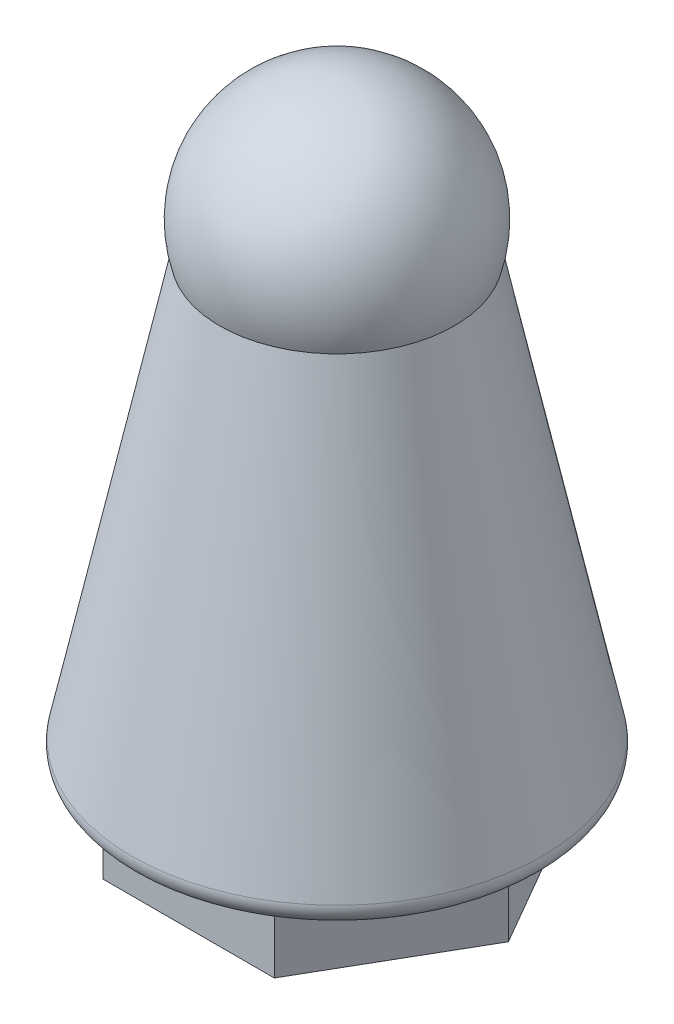
ISO-10303-21;
HEADER;
FILE_DESCRIPTION(('STEP AP214'),'2;1');
FILE_NAME('part.step','',(''),(''),'','','');
FILE_SCHEMA(('AUTOMOTIVE_DESIGN { 1 0 10303 214 1 1 1 1 }'));
ENDSEC;
DATA;
#1=APPLICATION_CONTEXT('core data for automotive mechanical design processes');
#2=APPLICATION_PROTOCOL_DEFINITION('international standard','automotive_design',2000,#1);
#3=PRODUCT_CONTEXT('',#1,'mechanical');
#4=PRODUCT('Part','Part','',(#3));
#5=PRODUCT_RELATED_PRODUCT_CATEGORY('part','',(#4));
#6=PRODUCT_DEFINITION_FORMATION('','',#4);
#7=PRODUCT_DEFINITION_CONTEXT('part definition',#1,'design');
#8=PRODUCT_DEFINITION('design','',#6,#7);
#9=PRODUCT_DEFINITION_SHAPE('','',#8);
#10=(LENGTH_UNIT() NAMED_UNIT(*) SI_UNIT(.MILLI.,.METRE.));
#11=(NAMED_UNIT(*) PLANE_ANGLE_UNIT() SI_UNIT($,.RADIAN.));
#12=(NAMED_UNIT(*) SI_UNIT($,.STERADIAN.) SOLID_ANGLE_UNIT());
#13=UNCERTAINTY_MEASURE_WITH_UNIT(LENGTH_MEASURE(1.E-05),#10,'distance_accuracy_value','');
#14=(GEOMETRIC_REPRESENTATION_CONTEXT(3) GLOBAL_UNCERTAINTY_ASSIGNED_CONTEXT((#13)) GLOBAL_UNIT_ASSIGNED_CONTEXT((#10,
#11,#12)) REPRESENTATION_CONTEXT('',''));
#15=CARTESIAN_POINT('',(0.,0.,0.));
#16=DIRECTION('',(0.,0.,1.));
#17=DIRECTION('',(1.,0.,0.));
#18=AXIS2_PLACEMENT_3D('',#15,#16,#17);
#19=CARTESIAN_POINT('',(0.,70.9501443061777,0.));
#20=DIRECTION('',(0.,-1.,0.));
#21=DIRECTION('',(-1.,0.,0.));
#22=AXIS2_PLACEMENT_3D('',#19,#20,#21);
#23=SPHERICAL_SURFACE('',#22,7.);
#24=CARTESIAN_POINT('',(0.,69.0050824594737,0.));
#25=DIRECTION('',(0.,-1.,0.));
#26=DIRECTION('',(0.,0.,-1.));
#27=AXIS2_PLACEMENT_3D('',#24,#25,#26);
#28=CIRCLE('',#27,6.72433895728766);
#29=CARTESIAN_POINT('',(0.,69.0050824594737,-6.72433895728766));
#30=VERTEX_POINT('',#29);
#31=EDGE_CURVE('E128',#30,#30,#28,.T.);
#32=ORIENTED_EDGE('',*,*,#31,.F.);
#33=EDGE_LOOP('',(#32));
#34=FACE_BOUND('',#33,.T.);
#35=ADVANCED_FACE('F39',(#34),#23,.T.);
#36=CARTESIAN_POINT('',(0.,69.0050824594737,0.));
#37=DIRECTION('',(0.,-1.,0.));
#38=DIRECTION('',(0.,0.,-1.));
#39=AXIS2_PLACEMENT_3D('',#36,#37,#38);
#40=CONICAL_SURFACE('',#39,6.72433895728766,0.20797507853601);
#41=CARTESIAN_POINT('',(0.,45.2115614975069,0.));
#42=DIRECTION('',(0.,1.,0.));
#43=DIRECTION('',(0.,0.,1.));
#44=AXIS2_PLACEMENT_3D('',#41,#42,#43);
#45=CIRCLE('',#44,11.745401021608);
#46=CARTESIAN_POINT('',(0.,45.2115614975069,11.745401021608));
#47=VERTEX_POINT('',#46);
#48=EDGE_CURVE('E11',#47,#47,#45,.T.);
#49=ORIENTED_EDGE('',*,*,#48,.T.);
#50=EDGE_LOOP('',(#49));
#51=FACE_BOUND('',#50,.T.);
#52=ORIENTED_EDGE('',*,*,#31,.T.);
#53=EDGE_LOOP('',(#52));
#54=FACE_BOUND('',#53,.T.);
#55=ADVANCED_FACE('F169',(#51,#54),#40,.T.);
#56=CARTESIAN_POINT('',(-12.,44.0050824594737,0.));
#57=DIRECTION('',(0.,1.,0.));
#58=DIRECTION('',(0.,0.,1.));
#59=AXIS2_PLACEMENT_3D('',#56,#57,#58);
#60=PLANE('',#59);
#61=CARTESIAN_POINT('',(0.,44.0050824594737,0.));
#62=DIRECTION('',(0.,1.,0.));
#63=DIRECTION('',(0.,0.,1.));
#64=AXIS2_PLACEMENT_3D('',#61,#62,#63);
#65=CIRCLE('',#64,10.7669499973595);
#66=CARTESIAN_POINT('',(0.,44.0050824594737,10.7669499973595));
#67=VERTEX_POINT('',#66);
#68=EDGE_CURVE('E47',#67,#67,#65,.F.);
#69=ORIENTED_EDGE('',*,*,#68,.T.);
#70=EDGE_LOOP('',(#69));
#71=FACE_BOUND('',#70,.T.);
#72=DIRECTION('',(0.5,0.,-0.866025403784439));
#73=VECTOR('',#72,1.);
#74=CARTESIAN_POINT('',(4.36121593216773,44.0050824594737,9.44615242270663));
#75=LINE('',#74,#73);
#76=CARTESIAN_POINT('',(4.90747728811182,44.0050824594737,8.5));
#77=VERTEX_POINT('',#76);
#78=CARTESIAN_POINT('',(9.81495457622364,44.0050824594737,0.));
#79=VERTEX_POINT('',#78);
#80=EDGE_CURVE('E141',#77,#79,#75,.T.);
#81=ORIENTED_EDGE('',*,*,#80,.T.);
#82=DIRECTION('',(-0.5,0.,-0.866025403784439));
#83=VECTOR('',#82,1.);
#84=CARTESIAN_POINT('',(4.36121593216774,44.0050824594737,-9.44615242270663));
#85=LINE('',#84,#83);
#86=CARTESIAN_POINT('',(4.90747728811182,44.0050824594737,-8.5));
#87=VERTEX_POINT('',#86);
#88=EDGE_CURVE('E97',#79,#87,#85,.T.);
#89=ORIENTED_EDGE('',*,*,#88,.T.);
#90=DIRECTION('',(-1.,0.,0.));
#91=VECTOR('',#90,1.);
#92=CARTESIAN_POINT('',(-12.,44.0050824594737,-8.5));
#93=LINE('',#92,#91);
#94=CARTESIAN_POINT('',(-4.90747728811182,44.0050824594737,-8.5));
#95=VERTEX_POINT('',#94);
#96=EDGE_CURVE('E62',#87,#95,#93,.T.);
#97=ORIENTED_EDGE('',*,*,#96,.T.);
#98=DIRECTION('',(-0.5,0.,0.866025403784439));
#99=VECTOR('',#98,1.);
#100=CARTESIAN_POINT('',(-10.3612159321677,44.0050824594737,0.946152422706632));
#101=LINE('',#100,#99);
#102=CARTESIAN_POINT('',(-9.81495457622364,44.0050824594737,0.));
#103=VERTEX_POINT('',#102);
#104=EDGE_CURVE('E149',#95,#103,#101,.T.);
#105=ORIENTED_EDGE('',*,*,#104,.T.);
#106=DIRECTION('',(0.5,0.,0.866025403784439));
#107=VECTOR('',#106,1.);
#108=CARTESIAN_POINT('',(-10.3612159321677,44.0050824594737,-0.946152422706632));
#109=LINE('',#108,#107);
#110=CARTESIAN_POINT('',(-4.90747728811182,44.0050824594737,8.5));
#111=VERTEX_POINT('',#110);
#112=EDGE_CURVE('E146',#103,#111,#109,.T.);
#113=ORIENTED_EDGE('',*,*,#112,.T.);
#114=DIRECTION('',(1.,0.,0.));
#115=VECTOR('',#114,1.);
#116=CARTESIAN_POINT('',(-12.,44.0050824594737,8.5));
#117=LINE('',#116,#115);
#118=EDGE_CURVE('E143',#111,#77,#117,.T.);
#119=ORIENTED_EDGE('',*,*,#118,.T.);
#120=EDGE_LOOP('',(#81,#89,#97,#105,#113,#119));
#121=FACE_BOUND('',#120,.T.);
#122=ADVANCED_FACE('F156',(#71,#121),#60,.F.);
#123=CARTESIAN_POINT('',(4.90747728811182,48.0050824594737,-8.5));
#124=DIRECTION('',(0.866025403784439,0.,-0.5));
#125=DIRECTION('',(-0.5,0.,-0.866025403784439));
#126=AXIS2_PLACEMENT_3D('',#123,#124,#125);
#127=PLANE('',#126);
#128=ORIENTED_EDGE('',*,*,#88,.F.);
#129=DIRECTION('',(0.,-1.,0.));
#130=VECTOR('',#129,1.);
#131=CARTESIAN_POINT('',(9.81495457622364,48.0050824594737,0.));
#132=LINE('',#131,#130);
#133=CARTESIAN_POINT('',(9.81495457622364,40.0050824594737,0.));
#134=VERTEX_POINT('',#133);
#135=EDGE_CURVE('E54',#79,#134,#132,.T.);
#136=ORIENTED_EDGE('',*,*,#135,.T.);
#137=DIRECTION('',(0.5,0.,0.866025403784439));
#138=VECTOR('',#137,1.);
#139=CARTESIAN_POINT('',(4.90747728811182,40.0050824594737,-8.5));
#140=LINE('',#139,#138);
#141=CARTESIAN_POINT('',(4.90747728811182,40.0050824594737,-8.5));
#142=VERTEX_POINT('',#141);
#143=EDGE_CURVE('E94',#142,#134,#140,.T.);
#144=ORIENTED_EDGE('',*,*,#143,.F.);
#145=DIRECTION('',(0.,-1.,0.));
#146=VECTOR('',#145,1.);
#147=CARTESIAN_POINT('',(4.90747728811182,48.0050824594737,-8.5));
#148=LINE('',#147,#146);
#149=EDGE_CURVE('E126',#87,#142,#148,.T.);
#150=ORIENTED_EDGE('',*,*,#149,.F.);
#151=EDGE_LOOP('',(#128,#136,#144,#150));
#152=FACE_BOUND('',#151,.T.);
#153=ADVANCED_FACE('F92',(#152),#127,.T.);
#154=CARTESIAN_POINT('',(-4.90747728811182,48.0050824594737,-8.5));
#155=DIRECTION('',(0.,0.,-1.));
#156=DIRECTION('',(-1.,0.,0.));
#157=AXIS2_PLACEMENT_3D('',#154,#155,#156);
#158=PLANE('',#157);
#159=ORIENTED_EDGE('',*,*,#96,.F.);
#160=ORIENTED_EDGE('',*,*,#149,.T.);
#161=DIRECTION('',(1.,0.,0.));
#162=VECTOR('',#161,1.);
#163=CARTESIAN_POINT('',(-4.90747728811182,40.0050824594737,-8.5));
#164=LINE('',#163,#162);
#165=CARTESIAN_POINT('',(-4.90747728811182,40.0050824594737,-8.5));
#166=VERTEX_POINT('',#165);
#167=EDGE_CURVE('E100',#166,#142,#164,.T.);
#168=ORIENTED_EDGE('',*,*,#167,.F.);
#169=DIRECTION('',(0.,-1.,0.));
#170=VECTOR('',#169,1.);
#171=CARTESIAN_POINT('',(-4.90747728811182,48.0050824594737,-8.5));
#172=LINE('',#171,#170);
#173=EDGE_CURVE('E129',#95,#166,#172,.T.);
#174=ORIENTED_EDGE('',*,*,#173,.F.);
#175=EDGE_LOOP('',(#159,#160,#168,#174));
#176=FACE_BOUND('',#175,.T.);
#177=ADVANCED_FACE('F181',(#176),#158,.T.);
#178=CARTESIAN_POINT('',(-9.81495457622364,48.0050824594737,0.));
#179=DIRECTION('',(-0.866025403784439,0.,-0.5));
#180=DIRECTION('',(-0.5,0.,0.866025403784439));
#181=AXIS2_PLACEMENT_3D('',#178,#179,#180);
#182=PLANE('',#181);
#183=ORIENTED_EDGE('',*,*,#104,.F.);
#184=ORIENTED_EDGE('',*,*,#173,.T.);
#185=DIRECTION('',(0.5,0.,-0.866025403784439));
#186=VECTOR('',#185,1.);
#187=CARTESIAN_POINT('',(-9.81495457622364,40.0050824594737,0.));
#188=LINE('',#187,#186);
#189=CARTESIAN_POINT('',(-9.81495457622364,40.0050824594737,0.));
#190=VERTEX_POINT('',#189);
#191=EDGE_CURVE('E123',#190,#166,#188,.T.);
#192=ORIENTED_EDGE('',*,*,#191,.F.);
#193=DIRECTION('',(0.,-1.,0.));
#194=VECTOR('',#193,1.);
#195=CARTESIAN_POINT('',(-9.81495457622364,48.0050824594737,0.));
#196=LINE('',#195,#194);
#197=EDGE_CURVE('E131',#103,#190,#196,.T.);
#198=ORIENTED_EDGE('',*,*,#197,.F.);
#199=EDGE_LOOP('',(#183,#184,#192,#198));
#200=FACE_BOUND('',#199,.T.);
#201=ADVANCED_FACE('F192',(#200),#182,.T.);
#202=CARTESIAN_POINT('',(-4.90747728811182,48.0050824594737,8.5));
#203=DIRECTION('',(-0.866025403784439,0.,0.5));
#204=DIRECTION('',(0.5,0.,0.866025403784439));
#205=AXIS2_PLACEMENT_3D('',#202,#203,#204);
#206=PLANE('',#205);
#207=ORIENTED_EDGE('',*,*,#112,.F.);
#208=ORIENTED_EDGE('',*,*,#197,.T.);
#209=DIRECTION('',(-0.5,0.,-0.866025403784439));
#210=VECTOR('',#209,1.);
#211=CARTESIAN_POINT('',(-4.90747728811182,40.0050824594737,8.5));
#212=LINE('',#211,#210);
#213=CARTESIAN_POINT('',(-4.90747728811182,40.0050824594737,8.5));
#214=VERTEX_POINT('',#213);
#215=EDGE_CURVE('E120',#214,#190,#212,.T.);
#216=ORIENTED_EDGE('',*,*,#215,.F.);
#217=DIRECTION('',(0.,-1.,0.));
#218=VECTOR('',#217,1.);
#219=CARTESIAN_POINT('',(-4.90747728811182,48.0050824594737,8.5));
#220=LINE('',#219,#218);
#221=EDGE_CURVE('E133',#111,#214,#220,.T.);
#222=ORIENTED_EDGE('',*,*,#221,.F.);
#223=EDGE_LOOP('',(#207,#208,#216,#222));
#224=FACE_BOUND('',#223,.T.);
#225=ADVANCED_FACE('F188',(#224),#206,.T.);
#226=CARTESIAN_POINT('',(4.90747728811182,48.0050824594737,8.5));
#227=DIRECTION('',(0.,0.,1.));
#228=DIRECTION('',(1.,0.,0.));
#229=AXIS2_PLACEMENT_3D('',#226,#227,#228);
#230=PLANE('',#229);
#231=ORIENTED_EDGE('',*,*,#118,.F.);
#232=ORIENTED_EDGE('',*,*,#221,.T.);
#233=DIRECTION('',(-1.,0.,0.));
#234=VECTOR('',#233,1.);
#235=CARTESIAN_POINT('',(4.90747728811182,40.0050824594737,8.5));
#236=LINE('',#235,#234);
#237=CARTESIAN_POINT('',(4.90747728811182,40.0050824594737,8.5));
#238=VERTEX_POINT('',#237);
#239=EDGE_CURVE('E109',#238,#214,#236,.T.);
#240=ORIENTED_EDGE('',*,*,#239,.F.);
#241=DIRECTION('',(0.,-1.,0.));
#242=VECTOR('',#241,1.);
#243=CARTESIAN_POINT('',(4.90747728811182,48.0050824594737,8.5));
#244=LINE('',#243,#242);
#245=EDGE_CURVE('E99',#77,#238,#244,.T.);
#246=ORIENTED_EDGE('',*,*,#245,.F.);
#247=EDGE_LOOP('',(#231,#232,#240,#246));
#248=FACE_BOUND('',#247,.T.);
#249=ADVANCED_FACE('F185',(#248),#230,.T.);
#250=CARTESIAN_POINT('',(9.81495457622364,48.0050824594737,0.));
#251=DIRECTION('',(0.866025403784439,0.,0.5));
#252=DIRECTION('',(0.5,0.,-0.866025403784439));
#253=AXIS2_PLACEMENT_3D('',#250,#251,#252);
#254=PLANE('',#253);
#255=ORIENTED_EDGE('',*,*,#80,.F.);
#256=ORIENTED_EDGE('',*,*,#245,.T.);
#257=DIRECTION('',(-0.5,0.,0.866025403784439));
#258=VECTOR('',#257,1.);
#259=CARTESIAN_POINT('',(9.81495457622364,40.0050824594737,0.));
#260=LINE('',#259,#258);
#261=EDGE_CURVE('E103',#134,#238,#260,.T.);
#262=ORIENTED_EDGE('',*,*,#261,.F.);
#263=ORIENTED_EDGE('',*,*,#135,.F.);
#264=EDGE_LOOP('',(#255,#256,#262,#263));
#265=FACE_BOUND('',#264,.T.);
#266=ADVANCED_FACE('F104',(#265),#254,.T.);
#267=CARTESIAN_POINT('',(0.,48.0050824594737,0.));
#268=DIRECTION('',(0.,-1.,0.));
#269=DIRECTION('',(0.,0.,-1.));
#270=AXIS2_PLACEMENT_3D('',#267,#268,#269);
#271=CYLINDRICAL_SURFACE('',#270,5.);
#272=CARTESIAN_POINT('',(0.,40.0050824594737,0.));
#273=DIRECTION('',(0.,-1.,0.));
#274=DIRECTION('',(0.,0.,-1.));
#275=AXIS2_PLACEMENT_3D('',#272,#273,#274);
#276=CIRCLE('',#275,5.);
#277=CARTESIAN_POINT('',(0.,40.0050824594737,-5.));
#278=VERTEX_POINT('',#277);
#279=EDGE_CURVE('E114',#278,#278,#276,.T.);
#280=ORIENTED_EDGE('',*,*,#279,.T.);
#281=EDGE_LOOP('',(#280));
#282=FACE_BOUND('',#281,.T.);
#283=CARTESIAN_POINT('',(0.,44.0050824594737,0.));
#284=DIRECTION('',(0.,1.,0.));
#285=DIRECTION('',(0.,0.,1.));
#286=AXIS2_PLACEMENT_3D('',#283,#284,#285);
#287=CIRCLE('',#286,5.);
#288=CARTESIAN_POINT('',(0.,44.0050824594737,5.));
#289=VERTEX_POINT('',#288);
#290=EDGE_CURVE('E138',#289,#289,#287,.T.);
#291=ORIENTED_EDGE('',*,*,#290,.T.);
#292=EDGE_LOOP('',(#291));
#293=FACE_BOUND('',#292,.T.);
#294=ADVANCED_FACE('F184',(#282,#293),#271,.F.);
#295=CARTESIAN_POINT('',(0.,40.0050824594737,0.));
#296=DIRECTION('',(0.,-1.,0.));
#297=DIRECTION('',(0.,0.,-1.));
#298=AXIS2_PLACEMENT_3D('',#295,#296,#297);
#299=PLANE('',#298);
#300=ORIENTED_EDGE('',*,*,#279,.F.);
#301=EDGE_LOOP('',(#300));
#302=FACE_BOUND('',#301,.T.);
#303=ORIENTED_EDGE('',*,*,#143,.T.);
#304=ORIENTED_EDGE('',*,*,#261,.T.);
#305=ORIENTED_EDGE('',*,*,#239,.T.);
#306=ORIENTED_EDGE('',*,*,#215,.T.);
#307=ORIENTED_EDGE('',*,*,#191,.T.);
#308=ORIENTED_EDGE('',*,*,#167,.T.);
#309=EDGE_LOOP('',(#303,#304,#305,#306,#307,#308));
#310=FACE_BOUND('',#309,.T.);
#311=ADVANCED_FACE('F111',(#302,#310),#299,.T.);
#312=ORIENTED_EDGE('',*,*,#290,.F.);
#313=EDGE_LOOP('',(#312));
#314=FACE_BOUND('',#313,.T.);
#315=ADVANCED_FACE('F160',(#314),#60,.F.);
#316=CARTESIAN_POINT('',(0.,45.0050824594737,0.));
#317=DIRECTION('',(0.,1.,0.));
#318=DIRECTION('',(0.,0.,1.));
#319=AXIS2_PLACEMENT_3D('',#316,#317,#318);
#320=TOROIDAL_SURFACE('',#319,10.7669499973595,1.);
#321=ORIENTED_EDGE('',*,*,#48,.F.);
#322=EDGE_LOOP('',(#321));
#323=FACE_BOUND('',#322,.T.);
#324=ORIENTED_EDGE('',*,*,#68,.F.);
#325=EDGE_LOOP('',(#324));
#326=FACE_BOUND('',#325,.T.);
#327=ADVANCED_FACE('F41',(#323,#326),#320,.T.);
#328=CLOSED_SHELL('',(#35,#55,#122,#153,#177,#201,#225,#249,#266,#294,#311,#315,#327));
#329=MANIFOLD_SOLID_BREP('B2',#328);
#330=ADVANCED_BREP_SHAPE_REPRESENTATION('',(#18,#329),#14);
#331=SHAPE_DEFINITION_REPRESENTATION(#9,#330);
ENDSEC;
END-ISO-10303-21;
